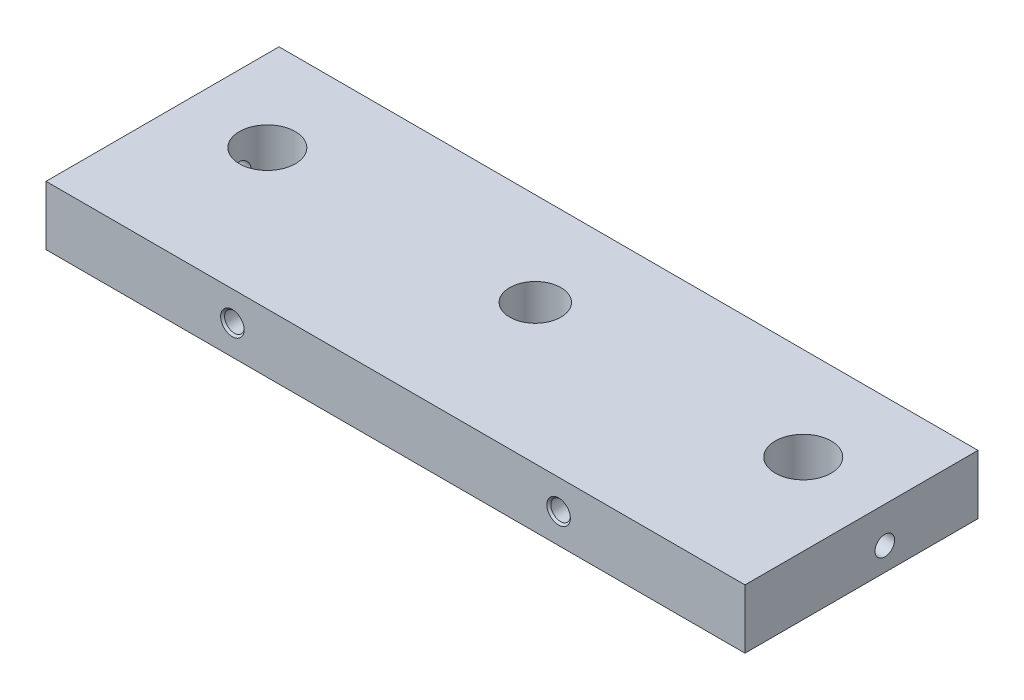
ISO-10303-21;
HEADER;
FILE_DESCRIPTION(('STEP AP214'),'2;1');
FILE_NAME('part.step','',(''),(''),'','','');
FILE_SCHEMA(('AUTOMOTIVE_DESIGN { 1 0 10303 214 1 1 1 1 }'));
ENDSEC;
DATA;
#1=APPLICATION_CONTEXT('core data for automotive mechanical design processes');
#2=APPLICATION_PROTOCOL_DEFINITION('international standard','automotive_design',2000,#1);
#3=PRODUCT_CONTEXT('',#1,'mechanical');
#4=PRODUCT('Part','Part','',(#3));
#5=PRODUCT_RELATED_PRODUCT_CATEGORY('part','',(#4));
#6=PRODUCT_DEFINITION_FORMATION('','',#4);
#7=PRODUCT_DEFINITION_CONTEXT('part definition',#1,'design');
#8=PRODUCT_DEFINITION('design','',#6,#7);
#9=PRODUCT_DEFINITION_SHAPE('','',#8);
#10=(LENGTH_UNIT() NAMED_UNIT(*) SI_UNIT(.MILLI.,.METRE.));
#11=(NAMED_UNIT(*) PLANE_ANGLE_UNIT() SI_UNIT($,.RADIAN.));
#12=(NAMED_UNIT(*) SI_UNIT($,.STERADIAN.) SOLID_ANGLE_UNIT());
#13=UNCERTAINTY_MEASURE_WITH_UNIT(LENGTH_MEASURE(1.E-05),#10,'distance_accuracy_value','');
#14=(GEOMETRIC_REPRESENTATION_CONTEXT(3) GLOBAL_UNCERTAINTY_ASSIGNED_CONTEXT((#13)) GLOBAL_UNIT_ASSIGNED_CONTEXT((#10,
#11,#12)) REPRESENTATION_CONTEXT('',''));
#15=CARTESIAN_POINT('',(0.,0.,0.));
#16=DIRECTION('',(0.,0.,1.));
#17=DIRECTION('',(1.,0.,0.));
#18=AXIS2_PLACEMENT_3D('',#15,#16,#17);
#19=CARTESIAN_POINT('',(0.,12.7,0.));
#20=DIRECTION('',(0.,-1.,0.));
#21=DIRECTION('',(0.,0.,-1.));
#22=AXIS2_PLACEMENT_3D('',#19,#20,#21);
#23=CYLINDRICAL_SURFACE('',#22,2.5);
#24=CARTESIAN_POINT('',(0.,0.,0.));
#25=DIRECTION('',(0.,1.,0.));
#26=DIRECTION('',(0.,0.,1.));
#27=AXIS2_PLACEMENT_3D('',#24,#25,#26);
#28=CIRCLE('',#27,2.5);
#29=CARTESIAN_POINT('',(0.,0.,2.5));
#30=VERTEX_POINT('',#29);
#31=EDGE_CURVE('E171',#30,#30,#28,.T.);
#32=ORIENTED_EDGE('',*,*,#31,.F.);
#33=EDGE_LOOP('',(#32));
#34=FACE_BOUND('',#33,.T.);
#35=CARTESIAN_POINT('',(0.,4.7,0.));
#36=DIRECTION('',(0.,1.,0.));
#37=DIRECTION('',(0.,0.,1.));
#38=AXIS2_PLACEMENT_3D('',#35,#36,#37);
#39=CIRCLE('',#38,2.5);
#40=CARTESIAN_POINT('',(0.,4.7,2.5));
#41=VERTEX_POINT('',#40);
#42=EDGE_CURVE('E168',#41,#41,#39,.T.);
#43=ORIENTED_EDGE('',*,*,#42,.T.);
#44=EDGE_LOOP('',(#43));
#45=FACE_BOUND('',#44,.T.);
#46=ADVANCED_FACE('F53',(#34,#45),#23,.F.);
#47=CARTESIAN_POINT('',(0.,12.7,0.));
#48=DIRECTION('',(0.,1.,0.));
#49=DIRECTION('',(0.,0.,1.));
#50=AXIS2_PLACEMENT_3D('',#47,#48,#49);
#51=PLANE('',#50);
#52=CARTESIAN_POINT('',(57.5,12.7,0.));
#53=DIRECTION('',(0.,1.,0.));
#54=DIRECTION('',(0.,0.,1.));
#55=AXIS2_PLACEMENT_3D('',#52,#53,#54);
#56=CIRCLE('',#55,5.99999999999999);
#57=CARTESIAN_POINT('',(57.5,12.7,5.99999999999998));
#58=VERTEX_POINT('',#57);
#59=EDGE_CURVE('E156',#58,#58,#56,.T.);
#60=ORIENTED_EDGE('',*,*,#59,.F.);
#61=EDGE_LOOP('',(#60));
#62=FACE_BOUND('',#61,.T.);
#63=CARTESIAN_POINT('',(-57.5,12.7,0.));
#64=DIRECTION('',(0.,1.,0.));
#65=DIRECTION('',(0.,0.,1.));
#66=AXIS2_PLACEMENT_3D('',#63,#64,#65);
#67=CIRCLE('',#66,5.99999999999999);
#68=CARTESIAN_POINT('',(-57.5,12.7,5.99999999999997));
#69=VERTEX_POINT('',#68);
#70=EDGE_CURVE('E155',#69,#69,#67,.T.);
#71=ORIENTED_EDGE('',*,*,#70,.F.);
#72=EDGE_LOOP('',(#71));
#73=FACE_BOUND('',#72,.T.);
#74=CARTESIAN_POINT('',(0.,12.7,0.));
#75=DIRECTION('',(0.,1.,0.));
#76=DIRECTION('',(0.,0.,1.));
#77=AXIS2_PLACEMENT_3D('',#74,#75,#76);
#78=CIRCLE('',#77,5.5);
#79=CARTESIAN_POINT('',(0.,12.7,5.5));
#80=VERTEX_POINT('',#79);
#81=EDGE_CURVE('E162',#80,#80,#78,.T.);
#82=ORIENTED_EDGE('',*,*,#81,.F.);
#83=EDGE_LOOP('',(#82));
#84=FACE_BOUND('',#83,.T.);
#85=DIRECTION('',(0.,0.,-1.));
#86=VECTOR('',#85,1.);
#87=CARTESIAN_POINT('',(75.,12.7,-20.));
#88=LINE('',#87,#86);
#89=CARTESIAN_POINT('',(75.,12.7,30.));
#90=VERTEX_POINT('',#89);
#91=CARTESIAN_POINT('',(75.,12.7,-20.));
#92=VERTEX_POINT('',#91);
#93=EDGE_CURVE('E175',#90,#92,#88,.T.);
#94=ORIENTED_EDGE('',*,*,#93,.T.);
#95=DIRECTION('',(-1.,0.,0.));
#96=VECTOR('',#95,1.);
#97=CARTESIAN_POINT('',(-75.,12.7,-20.));
#98=LINE('',#97,#96);
#99=CARTESIAN_POINT('',(-75.,12.7,-20.));
#100=VERTEX_POINT('',#99);
#101=EDGE_CURVE('E77',#92,#100,#98,.T.);
#102=ORIENTED_EDGE('',*,*,#101,.T.);
#103=DIRECTION('',(0.,0.,1.));
#104=VECTOR('',#103,1.);
#105=CARTESIAN_POINT('',(-75.,12.7,-20.));
#106=LINE('',#105,#104);
#107=CARTESIAN_POINT('',(-75.,12.7,30.));
#108=VERTEX_POINT('',#107);
#109=EDGE_CURVE('E178',#100,#108,#106,.T.);
#110=ORIENTED_EDGE('',*,*,#109,.T.);
#111=DIRECTION('',(1.,0.,0.));
#112=VECTOR('',#111,1.);
#113=CARTESIAN_POINT('',(-75.,12.7,30.));
#114=LINE('',#113,#112);
#115=EDGE_CURVE('E135',#108,#90,#114,.T.);
#116=ORIENTED_EDGE('',*,*,#115,.T.);
#117=EDGE_LOOP('',(#94,#102,#110,#116));
#118=FACE_BOUND('',#117,.T.);
#119=ADVANCED_FACE('F228',(#62,#73,#84,#118),#51,.T.);
#120=CARTESIAN_POINT('',(0.,0.,0.));
#121=DIRECTION('',(0.,1.,0.));
#122=DIRECTION('',(0.,0.,1.));
#123=AXIS2_PLACEMENT_3D('',#120,#121,#122);
#124=PLANE('',#123);
#125=CARTESIAN_POINT('',(57.5,0.,0.));
#126=DIRECTION('',(0.,1.,0.));
#127=DIRECTION('',(0.,0.,1.));
#128=AXIS2_PLACEMENT_3D('',#125,#126,#127);
#129=CIRCLE('',#128,5.99999999999999);
#130=CARTESIAN_POINT('',(57.5,0.,5.99999999999998));
#131=VERTEX_POINT('',#130);
#132=EDGE_CURVE('E152',#131,#131,#129,.T.);
#133=ORIENTED_EDGE('',*,*,#132,.T.);
#134=EDGE_LOOP('',(#133));
#135=FACE_BOUND('',#134,.T.);
#136=CARTESIAN_POINT('',(-57.5,0.,0.));
#137=DIRECTION('',(0.,1.,0.));
#138=DIRECTION('',(0.,0.,1.));
#139=AXIS2_PLACEMENT_3D('',#136,#137,#138);
#140=CIRCLE('',#139,5.99999999999999);
#141=CARTESIAN_POINT('',(-57.5,0.,5.99999999999997));
#142=VERTEX_POINT('',#141);
#143=EDGE_CURVE('E159',#142,#142,#140,.T.);
#144=ORIENTED_EDGE('',*,*,#143,.T.);
#145=EDGE_LOOP('',(#144));
#146=FACE_BOUND('',#145,.T.);
#147=DIRECTION('',(0.,0.,-1.));
#148=VECTOR('',#147,1.);
#149=CARTESIAN_POINT('',(75.,0.,-20.));
#150=LINE('',#149,#148);
#151=CARTESIAN_POINT('',(75.,0.,30.));
#152=VERTEX_POINT('',#151);
#153=CARTESIAN_POINT('',(75.,0.,-20.));
#154=VERTEX_POINT('',#153);
#155=EDGE_CURVE('E174',#152,#154,#150,.T.);
#156=ORIENTED_EDGE('',*,*,#155,.F.);
#157=DIRECTION('',(-1.,0.,0.));
#158=VECTOR('',#157,1.);
#159=CARTESIAN_POINT('',(-75.,0.,30.));
#160=LINE('',#159,#158);
#161=CARTESIAN_POINT('',(-75.,0.,30.));
#162=VERTEX_POINT('',#161);
#163=EDGE_CURVE('E142',#152,#162,#160,.T.);
#164=ORIENTED_EDGE('',*,*,#163,.T.);
#165=DIRECTION('',(0.,0.,1.));
#166=VECTOR('',#165,1.);
#167=CARTESIAN_POINT('',(-75.,0.,-20.));
#168=LINE('',#167,#166);
#169=CARTESIAN_POINT('',(-75.,0.,-20.));
#170=VERTEX_POINT('',#169);
#171=EDGE_CURVE('E94',#170,#162,#168,.T.);
#172=ORIENTED_EDGE('',*,*,#171,.F.);
#173=DIRECTION('',(-1.,0.,0.));
#174=VECTOR('',#173,1.);
#175=CARTESIAN_POINT('',(-75.,0.,-20.));
#176=LINE('',#175,#174);
#177=EDGE_CURVE('E88',#154,#170,#176,.T.);
#178=ORIENTED_EDGE('',*,*,#177,.F.);
#179=EDGE_LOOP('',(#156,#164,#172,#178));
#180=FACE_BOUND('',#179,.T.);
#181=ORIENTED_EDGE('',*,*,#31,.T.);
#182=EDGE_LOOP('',(#181));
#183=FACE_BOUND('',#182,.T.);
#184=ADVANCED_FACE('F234',(#135,#146,#180,#183),#124,.F.);
#185=CARTESIAN_POINT('',(75.,12.7,-20.));
#186=DIRECTION('',(-1.,0.,0.));
#187=DIRECTION('',(0.,0.,1.));
#188=AXIS2_PLACEMENT_3D('',#185,#186,#187);
#189=PLANE('',#188);
#190=CARTESIAN_POINT('',(75.,5.,0.));
#191=DIRECTION('',(1.,0.,0.));
#192=DIRECTION('',(0.,0.,-1.));
#193=AXIS2_PLACEMENT_3D('',#190,#191,#192);
#194=CIRCLE('',#193,2.09999999999999);
#195=CARTESIAN_POINT('',(75.,5.,-2.09999999999996));
#196=VERTEX_POINT('',#195);
#197=EDGE_CURVE('E148',#196,#196,#194,.T.);
#198=ORIENTED_EDGE('',*,*,#197,.F.);
#199=EDGE_LOOP('',(#198));
#200=FACE_BOUND('',#199,.T.);
#201=ORIENTED_EDGE('',*,*,#155,.T.);
#202=DIRECTION('',(0.,-1.,0.));
#203=VECTOR('',#202,1.);
#204=CARTESIAN_POINT('',(75.,12.7,-20.));
#205=LINE('',#204,#203);
#206=EDGE_CURVE('E13',#92,#154,#205,.T.);
#207=ORIENTED_EDGE('',*,*,#206,.F.);
#208=ORIENTED_EDGE('',*,*,#93,.F.);
#209=DIRECTION('',(0.,1.,0.));
#210=VECTOR('',#209,1.);
#211=CARTESIAN_POINT('',(75.,-150.332963783729,30.));
#212=LINE('',#211,#210);
#213=EDGE_CURVE('E139',#152,#90,#212,.T.);
#214=ORIENTED_EDGE('',*,*,#213,.F.);
#215=EDGE_LOOP('',(#201,#207,#208,#214));
#216=FACE_BOUND('',#215,.T.);
#217=ADVANCED_FACE('F55',(#200,#216),#189,.F.);
#218=CARTESIAN_POINT('',(-75.,12.7,-20.));
#219=DIRECTION('',(0.,0.,1.));
#220=DIRECTION('',(1.,0.,0.));
#221=AXIS2_PLACEMENT_3D('',#218,#219,#220);
#222=PLANE('',#221);
#223=ORIENTED_EDGE('',*,*,#177,.T.);
#224=DIRECTION('',(0.,-1.,0.));
#225=VECTOR('',#224,1.);
#226=CARTESIAN_POINT('',(-75.,12.7,-20.));
#227=LINE('',#226,#225);
#228=EDGE_CURVE('E68',#100,#170,#227,.T.);
#229=ORIENTED_EDGE('',*,*,#228,.F.);
#230=ORIENTED_EDGE('',*,*,#101,.F.);
#231=ORIENTED_EDGE('',*,*,#206,.T.);
#232=EDGE_LOOP('',(#223,#229,#230,#231));
#233=FACE_BOUND('',#232,.T.);
#234=ADVANCED_FACE('F248',(#233),#222,.F.);
#235=CARTESIAN_POINT('',(-75.,12.7,-20.));
#236=DIRECTION('',(1.,0.,0.));
#237=DIRECTION('',(0.,0.,-1.));
#238=AXIS2_PLACEMENT_3D('',#235,#236,#237);
#239=PLANE('',#238);
#240=CARTESIAN_POINT('',(-75.,5.,0.));
#241=DIRECTION('',(-1.,0.,0.));
#242=DIRECTION('',(0.,0.,1.));
#243=AXIS2_PLACEMENT_3D('',#240,#241,#242);
#244=CIRCLE('',#243,2.09999999999999);
#245=CARTESIAN_POINT('',(-75.,5.,2.10000000000002));
#246=VERTEX_POINT('',#245);
#247=EDGE_CURVE('E145',#246,#246,#244,.T.);
#248=ORIENTED_EDGE('',*,*,#247,.F.);
#249=EDGE_LOOP('',(#248));
#250=FACE_BOUND('',#249,.T.);
#251=ORIENTED_EDGE('',*,*,#171,.T.);
#252=DIRECTION('',(0.,1.,0.));
#253=VECTOR('',#252,1.);
#254=CARTESIAN_POINT('',(-75.,-150.332963783729,30.));
#255=LINE('',#254,#253);
#256=EDGE_CURVE('E138',#162,#108,#255,.T.);
#257=ORIENTED_EDGE('',*,*,#256,.T.);
#258=ORIENTED_EDGE('',*,*,#109,.F.);
#259=ORIENTED_EDGE('',*,*,#228,.T.);
#260=EDGE_LOOP('',(#251,#257,#258,#259));
#261=FACE_BOUND('',#260,.T.);
#262=ADVANCED_FACE('F246',(#250,#261),#239,.F.);
#263=CARTESIAN_POINT('',(0.,4.7,0.));
#264=DIRECTION('',(0.,1.,0.));
#265=DIRECTION('',(0.,0.,1.));
#266=AXIS2_PLACEMENT_3D('',#263,#264,#265);
#267=CYLINDRICAL_SURFACE('',#266,5.5);
#268=CARTESIAN_POINT('',(0.,4.7,0.));
#269=DIRECTION('',(0.,1.,0.));
#270=DIRECTION('',(0.,0.,1.));
#271=AXIS2_PLACEMENT_3D('',#268,#269,#270);
#272=CIRCLE('',#271,5.5);
#273=CARTESIAN_POINT('',(0.,4.7,5.5));
#274=VERTEX_POINT('',#273);
#275=EDGE_CURVE('E165',#274,#274,#272,.T.);
#276=ORIENTED_EDGE('',*,*,#275,.F.);
#277=EDGE_LOOP('',(#276));
#278=FACE_BOUND('',#277,.T.);
#279=ORIENTED_EDGE('',*,*,#81,.T.);
#280=EDGE_LOOP('',(#279));
#281=FACE_BOUND('',#280,.T.);
#282=ADVANCED_FACE('F240',(#278,#281),#267,.F.);
#283=CARTESIAN_POINT('',(0.,4.7,0.));
#284=DIRECTION('',(0.,1.,0.));
#285=DIRECTION('',(0.,0.,1.));
#286=AXIS2_PLACEMENT_3D('',#283,#284,#285);
#287=PLANE('',#286);
#288=ORIENTED_EDGE('',*,*,#42,.F.);
#289=EDGE_LOOP('',(#288));
#290=FACE_BOUND('',#289,.T.);
#291=ORIENTED_EDGE('',*,*,#275,.T.);
#292=EDGE_LOOP('',(#291));
#293=FACE_BOUND('',#292,.T.);
#294=ADVANCED_FACE('F283',(#290,#293),#287,.T.);
#295=CARTESIAN_POINT('',(-57.5,0.,0.));
#296=DIRECTION('',(0.,1.,0.));
#297=DIRECTION('',(0.,0.,1.));
#298=AXIS2_PLACEMENT_3D('',#295,#296,#297);
#299=CYLINDRICAL_SURFACE('',#298,5.99999999999999);
#300=CARTESIAN_POINT('',(-63.1204981985585,5.,2.10000000000002));
#301=CARTESIAN_POINT('',(-63.1204966458315,5.1140091370659,2.1000018339205));
#302=CARTESIAN_POINT('',(-63.124004968313,5.22800549976908,2.09068443415072));
#303=CARTESIAN_POINT('',(-63.1375766475587,5.45259753612682,2.05380341211712));
#304=CARTESIAN_POINT('',(-63.1476405489665,5.5631929264259,2.0262382738113));
#305=CARTESIAN_POINT('',(-63.1730467856986,5.77768801016566,1.95396754262055));
#306=CARTESIAN_POINT('',(-63.1883778981936,5.88160138658303,1.90929837025932));
#307=CARTESIAN_POINT('',(-63.2225741385746,6.08049606044282,1.80421393109005));
#308=CARTESIAN_POINT('',(-63.241440164637,6.17547507854585,1.7437946608533));
#309=CARTESIAN_POINT('',(-63.2814940549531,6.35790717006958,1.6061297637904));
#310=CARTESIAN_POINT('',(-63.3027439771116,6.44491870630237,1.52831692511241));
#311=CARTESIAN_POINT('',(-63.3446495230056,6.60496249641996,1.35928149750695));
#312=CARTESIAN_POINT('',(-63.3653050393113,6.67799223662496,1.26805650251295));
#313=CARTESIAN_POINT('',(-63.4044203342876,6.81005007735195,1.07151011163138));
#314=CARTESIAN_POINT('',(-63.4227987194029,6.86860885404572,0.965855744444216));
#315=CARTESIAN_POINT('',(-63.4545521614655,6.96694377064913,0.745440860528128));
#316=CARTESIAN_POINT('',(-63.4679287144991,7.00672552784472,0.630683079168889));
#317=CARTESIAN_POINT('',(-63.487731406374,7.06486014648584,0.399953329353765));
#318=CARTESIAN_POINT('',(-63.4944026630635,7.08397084703124,0.284193742860517));
#319=CARTESIAN_POINT('',(-63.500916889704,7.10263770519153,0.0509313612863235));
#320=CARTESIAN_POINT('',(-63.5007617963171,7.10219940893304,-0.0665709299255688));
#321=CARTESIAN_POINT('',(-63.4938029881401,7.08224623019269,-0.294593124821921));
#322=CARTESIAN_POINT('',(-63.4872866813232,7.06355598179706,-0.405195428634518));
#323=CARTESIAN_POINT('',(-63.4687047041447,7.00900218324641,-0.621581077155464));
#324=CARTESIAN_POINT('',(-63.4566386491988,6.97313744293342,-0.727364087339952));
#325=CARTESIAN_POINT('',(-63.4279632181631,6.88481041807335,-0.932828899090593));
#326=CARTESIAN_POINT('',(-63.4112935314734,6.83212624879887,-1.03240655008797));
#327=CARTESIAN_POINT('',(-63.3751275446253,6.71184352800499,-1.22154070440795));
#328=CARTESIAN_POINT('',(-63.3556304054743,6.64424054649508,-1.31109421923471));
#329=CARTESIAN_POINT('',(-63.3146607396164,6.49195271186357,-1.48252795143933));
#330=CARTESIAN_POINT('',(-63.293138193974,6.40656677898385,-1.56377436704441));
#331=CARTESIAN_POINT('',(-63.2513741792681,6.22321760973066,-1.71101327031468));
#332=CARTESIAN_POINT('',(-63.2311329525691,6.12525200443313,-1.77700287834314));
#333=CARTESIAN_POINT('',(-63.1939329395488,5.91732795856173,-1.89285691923173));
#334=CARTESIAN_POINT('',(-63.1770363214733,5.80719282631497,-1.94242576165354));
#335=CARTESIAN_POINT('',(-63.1491557259306,5.57939519101917,-2.02208854460279));
#336=CARTESIAN_POINT('',(-63.1381689626197,5.46173626392651,-2.05219166242459));
#337=CARTESIAN_POINT('',(-63.1239926358183,5.2284219502318,-2.09071998372685));
#338=CARTESIAN_POINT('',(-63.1204464929988,5.1129521614298,-2.10013762361123));
#339=CARTESIAN_POINT('',(-63.1205510138731,4.88205250370018,-2.09985940605156));
#340=CARTESIAN_POINT('',(-63.1242001922755,4.76662263145226,-2.09016749328912));
#341=CARTESIAN_POINT('',(-63.1379260131842,4.54380912898156,-2.05284050372254));
#342=CARTESIAN_POINT('',(-63.1477449606931,4.43628747984392,-2.02592405668399));
#343=CARTESIAN_POINT('',(-63.1724118358719,4.22731815862595,-1.95579041232055));
#344=CARTESIAN_POINT('',(-63.187260710863,4.12587163495472,-1.91257014420928));
#345=CARTESIAN_POINT('',(-63.2209397100575,3.92809433349761,-1.80938709290028));
#346=CARTESIAN_POINT('',(-63.2398883080368,3.83205588297778,-1.74890374170461));
#347=CARTESIAN_POINT('',(-63.2794141217829,3.65113493086169,-1.61348700379824));
#348=CARTESIAN_POINT('',(-63.299991862819,3.56625605100199,-1.53854894531551));
#349=CARTESIAN_POINT('',(-63.3417987141558,3.40532762874549,-1.37155948469128));
#350=CARTESIAN_POINT('',(-63.3630031413794,3.33000068441338,-1.27880333095804));
#351=CARTESIAN_POINT('',(-63.4025922369693,3.19591891840493,-1.08144356167346));
#352=CARTESIAN_POINT('',(-63.4209769708418,3.13716371171272,-0.976840221450291));
#353=CARTESIAN_POINT('',(-63.4527928174187,3.03838744346695,-0.759129698058994));
#354=CARTESIAN_POINT('',(-63.4662513931254,2.99826217380438,-0.646074027219683));
#355=CARTESIAN_POINT('',(-63.4868116209636,2.93778465141936,-0.414248850041598));
#356=CARTESIAN_POINT('',(-63.4939158314934,2.91742444059474,-0.295481663590913));
#357=CARTESIAN_POINT('',(-63.5007543784024,2.89782775243787,-0.0621821302513846));
#358=CARTESIAN_POINT('',(-63.5008490305037,2.8975585229167,0.0522537808564348));
#359=CARTESIAN_POINT('',(-63.4945652025212,2.91556165774852,0.279465044357248));
#360=CARTESIAN_POINT('',(-63.488187341248,2.93383224958515,0.392240554448695));
#361=CARTESIAN_POINT('',(-63.4698207390078,2.98769281511968,0.610778183645926));
#362=CARTESIAN_POINT('',(-63.4579408866853,3.0229471878998,0.716632835676179));
#363=CARTESIAN_POINT('',(-63.4297968290422,3.10945562590669,0.920954416283868));
#364=CARTESIAN_POINT('',(-63.4135318086933,3.16071266567333,1.01941996716774));
#365=CARTESIAN_POINT('',(-63.3774819301746,3.2800726297771,1.21038035179721));
#366=CARTESIAN_POINT('',(-63.3575841614481,3.34875672859404,1.30249027603848));
#367=CARTESIAN_POINT('',(-63.3167443389257,3.50006159937585,1.47420813664786));
#368=CARTESIAN_POINT('',(-63.2958019368387,3.58268704169577,1.55381186612158));
#369=CARTESIAN_POINT('',(-63.254114729544,3.76390225412879,1.70186578231576));
#370=CARTESIAN_POINT('',(-63.2334198977672,3.86303759965216,1.76966457617211));
#371=CARTESIAN_POINT('',(-63.1956781363437,4.07194862858986,1.88761831198952));
#372=CARTESIAN_POINT('',(-63.1786307346966,4.18172293258171,1.93777553742173));
#373=CARTESIAN_POINT('',(-63.1505252243276,4.40768257816286,2.01826100468313));
#374=CARTESIAN_POINT('',(-63.1394028261945,4.52378337592957,2.04880286372062));
#375=CARTESIAN_POINT('',(-63.1243917548635,4.75992869919569,2.08966685598285));
#376=CARTESIAN_POINT('',(-63.1204998332662,4.87997142904268,2.09999806925255));
#377=CARTESIAN_POINT('',(-63.1204981985585,5.,2.10000000000002));
#378=B_SPLINE_CURVE_WITH_KNOTS('',3,(#300,#301,#302,#303,#304,#305,#306,#307,#308,#309,#310,
#311,#312,#313,#314,#315,#316,#317,#318,#319,#320,#321,#322,#323,#324,#325,#326,#327,#328,#329,
#330,#331,#332,#333,#334,#335,#336,#337,#338,#339,#340,#341,#342,#343,#344,#345,#346,#347,#348,
#349,#350,#351,#352,#353,#354,#355,#356,#357,#358,#359,#360,#361,#362,#363,#364,#365,#366,#367,
#368,#369,#370,#371,#372,#373,#374,#375,#376,#377),.UNSPECIFIED.,.T.,.F.,(4,2,2,2,2,2,2,2,2,2,2,
2,2,2,2,2,2,2,2,2,2,2,2,2,2,2,2,2,2,2,2,2,2,2,2,2,2,2,4),(0.,0.341581962713035,
0.683192307989642,1.02407925348462,1.36505293174606,1.71940579240762,2.07382229975039,
2.43855298376331,2.80317448659719,3.15392083853409,3.5045676829967,3.8400719478235,
4.17559946579063,4.51575014165979,4.85600195806707,5.213799059425,5.57166363794493,
5.93565848344082,6.29948159486755,6.6454288702843,6.99130474115208,7.32361553252675,
7.6559889451342,7.99969400689681,8.34351034108725,8.70586039893279,9.06820203750371,
9.42849171734221,9.78863627174603,10.1302545747611,10.471840220127,10.806936933281,
11.1420959705822,11.4903822545165,11.8387854469785,12.2026433598833,12.5664541587759,
12.9262325794049,13.2858493250833),.UNSPECIFIED.);
#379=CARTESIAN_POINT('',(-63.1204981985585,5.,2.10000000000002));
#380=VERTEX_POINT('',#379);
#381=EDGE_CURVE('E57',#380,#380,#378,.T.);
#382=ORIENTED_EDGE('',*,*,#381,.T.);
#383=EDGE_LOOP('',(#382));
#384=FACE_BOUND('',#383,.T.);
#385=ORIENTED_EDGE('',*,*,#143,.F.);
#386=EDGE_LOOP('',(#385));
#387=FACE_BOUND('',#386,.T.);
#388=ORIENTED_EDGE('',*,*,#70,.T.);
#389=EDGE_LOOP('',(#388));
#390=FACE_BOUND('',#389,.T.);
#391=ADVANCED_FACE('F273',(#384,#387,#390),#299,.F.);
#392=CARTESIAN_POINT('',(57.5,0.,0.));
#393=DIRECTION('',(0.,1.,0.));
#394=DIRECTION('',(0.,0.,1.));
#395=AXIS2_PLACEMENT_3D('',#392,#393,#394);
#396=CYLINDRICAL_SURFACE('',#395,5.99999999999999);
#397=CARTESIAN_POINT('',(63.1204981985585,5.,-2.09999999999996));
#398=CARTESIAN_POINT('',(63.1204966458315,5.1140091370659,-2.10000183392044));
#399=CARTESIAN_POINT('',(63.124004968313,5.22800549976908,-2.09068443415066));
#400=CARTESIAN_POINT('',(63.1375766475587,5.45259753612682,-2.05380341211706));
#401=CARTESIAN_POINT('',(63.1476405489665,5.5631929264259,-2.02623827381124));
#402=CARTESIAN_POINT('',(63.1730467856986,5.77768801016566,-1.95396754262049));
#403=CARTESIAN_POINT('',(63.1883778981936,5.88160138658303,-1.90929837025926));
#404=CARTESIAN_POINT('',(63.2225741385746,6.08049606044283,-1.80421393108999));
#405=CARTESIAN_POINT('',(63.241440164637,6.17547507854585,-1.74379466085324));
#406=CARTESIAN_POINT('',(63.2814940549531,6.35790717006958,-1.60612976379034));
#407=CARTESIAN_POINT('',(63.3027439771117,6.44491870630238,-1.52831692511235));
#408=CARTESIAN_POINT('',(63.3446495230056,6.60496249641997,-1.35928149750689));
#409=CARTESIAN_POINT('',(63.3653050393113,6.67799223662497,-1.26805650251289));
#410=CARTESIAN_POINT('',(63.4044203342876,6.81005007735196,-1.07151011163132));
#411=CARTESIAN_POINT('',(63.4227987194029,6.86860885404572,-0.965855744444151));
#412=CARTESIAN_POINT('',(63.4545521614655,6.96694377064913,-0.745440860528063));
#413=CARTESIAN_POINT('',(63.4679287144991,7.00672552784473,-0.630683079168824));
#414=CARTESIAN_POINT('',(63.487731406374,7.06486014648584,-0.399953329353701));
#415=CARTESIAN_POINT('',(63.4944026630635,7.08397084703124,-0.284193742860453));
#416=CARTESIAN_POINT('',(63.5009168897039,7.10263770519153,-0.0509313612862595));
#417=CARTESIAN_POINT('',(63.5007617963171,7.10219940893304,0.0665709299256325));
#418=CARTESIAN_POINT('',(63.4938029881401,7.08224623019269,0.294593124821984));
#419=CARTESIAN_POINT('',(63.4872866813232,7.06355598179706,0.40519542863458));
#420=CARTESIAN_POINT('',(63.4687047041447,7.00900218324641,0.621581077155526));
#421=CARTESIAN_POINT('',(63.4566386491988,6.97313744293342,0.727364087340013));
#422=CARTESIAN_POINT('',(63.4279632181631,6.88481041807335,0.932828899090654));
#423=CARTESIAN_POINT('',(63.4112935314734,6.83212624879887,1.03240655008803));
#424=CARTESIAN_POINT('',(63.3751275446253,6.71184352800499,1.22154070440802));
#425=CARTESIAN_POINT('',(63.3556304054743,6.64424054649508,1.31109421923478));
#426=CARTESIAN_POINT('',(63.3146607396164,6.49195271186357,1.48252795143939));
#427=CARTESIAN_POINT('',(63.2931381939739,6.40656677898385,1.56377436704447));
#428=CARTESIAN_POINT('',(63.2513741792681,6.22321760973066,1.71101327031474));
#429=CARTESIAN_POINT('',(63.231132952569,6.12525200443312,1.7770028783432));
#430=CARTESIAN_POINT('',(63.1939329395487,5.91732795856173,1.89285691923179));
#431=CARTESIAN_POINT('',(63.1770363214732,5.80719282631497,1.94242576165361));
#432=CARTESIAN_POINT('',(63.1491557259306,5.57939519101917,2.02208854460285));
#433=CARTESIAN_POINT('',(63.1381689626196,5.4617362639265,2.05219166242465));
#434=CARTESIAN_POINT('',(63.1239926358182,5.2284219502318,2.09071998372691));
#435=CARTESIAN_POINT('',(63.1204464929988,5.11295216142979,2.10013762361129));
#436=CARTESIAN_POINT('',(63.120551013873,4.88205250370017,2.09985940605162));
#437=CARTESIAN_POINT('',(63.1242001922755,4.76662263145225,2.09016749328918));
#438=CARTESIAN_POINT('',(63.1379260131841,4.54380912898156,2.0528405037226));
#439=CARTESIAN_POINT('',(63.1477449606931,4.43628747984392,2.02592405668405));
#440=CARTESIAN_POINT('',(63.1724118358719,4.22731815862595,1.95579041232061));
#441=CARTESIAN_POINT('',(63.187260710863,4.12587163495472,1.91257014420934));
#442=CARTESIAN_POINT('',(63.2209397100574,3.92809433349761,1.80938709290034));
#443=CARTESIAN_POINT('',(63.2398883080367,3.83205588297778,1.74890374170467));
#444=CARTESIAN_POINT('',(63.2794141217829,3.65113493086169,1.6134870037983));
#445=CARTESIAN_POINT('',(63.2999918628189,3.56625605100199,1.53854894531557));
#446=CARTESIAN_POINT('',(63.3417987141557,3.40532762874549,1.37155948469134));
#447=CARTESIAN_POINT('',(63.3630031413794,3.33000068441339,1.2788033309581));
#448=CARTESIAN_POINT('',(63.4025922369693,3.19591891840493,1.08144356167352));
#449=CARTESIAN_POINT('',(63.4209769708418,3.13716371171272,0.976840221450354));
#450=CARTESIAN_POINT('',(63.4527928174186,3.03838744346695,0.759129698059055));
#451=CARTESIAN_POINT('',(63.4662513931254,2.99826217380438,0.646074027219743));
#452=CARTESIAN_POINT('',(63.4868116209636,2.93778465141936,0.414248850041657));
#453=CARTESIAN_POINT('',(63.4939158314934,2.91742444059474,0.295481663590971));
#454=CARTESIAN_POINT('',(63.5007543784024,2.89782775243787,0.0621821302514428));
#455=CARTESIAN_POINT('',(63.5008490305037,2.8975585229167,-0.0522537808563766));
#456=CARTESIAN_POINT('',(63.4945652025212,2.91556165774852,-0.279465044357189));
#457=CARTESIAN_POINT('',(63.488187341248,2.93383224958515,-0.392240554448637));
#458=CARTESIAN_POINT('',(63.4698207390078,2.98769281511968,-0.610778183645868));
#459=CARTESIAN_POINT('',(63.4579408866853,3.0229471878998,-0.71663283567612));
#460=CARTESIAN_POINT('',(63.4297968290422,3.10945562590669,-0.92095441628381));
#461=CARTESIAN_POINT('',(63.4135318086933,3.16071266567333,-1.01941996716768));
#462=CARTESIAN_POINT('',(63.3774819301746,3.2800726297771,-1.21038035179715));
#463=CARTESIAN_POINT('',(63.3575841614481,3.34875672859404,-1.30249027603843));
#464=CARTESIAN_POINT('',(63.3167443389257,3.50006159937586,-1.47420813664781));
#465=CARTESIAN_POINT('',(63.2958019368387,3.58268704169578,-1.55381186612152));
#466=CARTESIAN_POINT('',(63.254114729544,3.7639022541288,-1.7018657823157));
#467=CARTESIAN_POINT('',(63.2334198977672,3.86303759965216,-1.76966457617205));
#468=CARTESIAN_POINT('',(63.1956781363437,4.07194862858986,-1.88761831198946));
#469=CARTESIAN_POINT('',(63.1786307346966,4.18172293258171,-1.93777553742167));
#470=CARTESIAN_POINT('',(63.1505252243276,4.40768257816285,-2.01826100468307));
#471=CARTESIAN_POINT('',(63.1394028261945,4.52378337592957,-2.04880286372056));
#472=CARTESIAN_POINT('',(63.1243917548635,4.75992869919569,-2.08966685598279));
#473=CARTESIAN_POINT('',(63.1204998332662,4.87997142904268,-2.09999806925249));
#474=CARTESIAN_POINT('',(63.1204981985585,5.,-2.09999999999996));
#475=B_SPLINE_CURVE_WITH_KNOTS('',3,(#397,#398,#399,#400,#401,#402,#403,#404,#405,#406,#407,
#408,#409,#410,#411,#412,#413,#414,#415,#416,#417,#418,#419,#420,#421,#422,#423,#424,#425,#426,
#427,#428,#429,#430,#431,#432,#433,#434,#435,#436,#437,#438,#439,#440,#441,#442,#443,#444,#445,
#446,#447,#448,#449,#450,#451,#452,#453,#454,#455,#456,#457,#458,#459,#460,#461,#462,#463,#464,
#465,#466,#467,#468,#469,#470,#471,#472,#473,#474),.UNSPECIFIED.,.T.,.F.,(4,2,2,2,2,2,2,2,2,2,2,
2,2,2,2,2,2,2,2,2,2,2,2,2,2,2,2,2,2,2,2,2,2,2,2,2,2,2,4),(0.,0.341581962713036,
0.683192307989643,1.02407925348462,1.36505293174606,1.71940579240763,2.07382229975039,
2.43855298376331,2.80317448659719,3.15392083853409,3.5045676829967,3.84007194782349,
4.17559946579063,4.51575014165979,4.85600195806707,5.213799059425,5.57166363794493,
5.93565848344082,6.29948159486755,6.6454288702843,6.99130474115208,7.32361553252675,
7.6559889451342,7.99969400689681,8.34351034108725,8.70586039893278,9.06820203750371,
9.42849171734221,9.78863627174603,10.1302545747611,10.471840220127,10.806936933281,
11.1420959705822,11.4903822545165,11.8387854469785,12.2026433598833,12.5664541587759,
12.9262325794049,13.2858493250833),.UNSPECIFIED.);
#476=CARTESIAN_POINT('',(63.1204981985585,5.,-2.09999999999996));
#477=VERTEX_POINT('',#476);
#478=EDGE_CURVE('E151',#477,#477,#475,.T.);
#479=ORIENTED_EDGE('',*,*,#478,.T.);
#480=EDGE_LOOP('',(#479));
#481=FACE_BOUND('',#480,.T.);
#482=ORIENTED_EDGE('',*,*,#132,.F.);
#483=EDGE_LOOP('',(#482));
#484=FACE_BOUND('',#483,.T.);
#485=ORIENTED_EDGE('',*,*,#59,.T.);
#486=EDGE_LOOP('',(#485));
#487=FACE_BOUND('',#486,.T.);
#488=ADVANCED_FACE('F192',(#481,#484,#487),#396,.F.);
#489=CARTESIAN_POINT('',(75.,5.,0.));
#490=DIRECTION('',(1.,0.,0.));
#491=DIRECTION('',(0.,0.,-1.));
#492=AXIS2_PLACEMENT_3D('',#489,#490,#491);
#493=CYLINDRICAL_SURFACE('',#492,2.09999999999999);
#494=ORIENTED_EDGE('',*,*,#197,.T.);
#495=EDGE_LOOP('',(#494));
#496=FACE_BOUND('',#495,.T.);
#497=ORIENTED_EDGE('',*,*,#478,.F.);
#498=EDGE_LOOP('',(#497));
#499=FACE_BOUND('',#498,.T.);
#500=ADVANCED_FACE('F194',(#496,#499),#493,.F.);
#501=CARTESIAN_POINT('',(-75.,5.,0.));
#502=DIRECTION('',(-1.,0.,0.));
#503=DIRECTION('',(0.,0.,1.));
#504=AXIS2_PLACEMENT_3D('',#501,#502,#503);
#505=CYLINDRICAL_SURFACE('',#504,2.09999999999999);
#506=ORIENTED_EDGE('',*,*,#247,.T.);
#507=EDGE_LOOP('',(#506));
#508=FACE_BOUND('',#507,.T.);
#509=ORIENTED_EDGE('',*,*,#381,.F.);
#510=EDGE_LOOP('',(#509));
#511=FACE_BOUND('',#510,.T.);
#512=ADVANCED_FACE('F197',(#508,#511),#505,.F.);
#513=CARTESIAN_POINT('',(-75.,-150.332963783729,30.));
#514=DIRECTION('',(0.,0.,1.));
#515=DIRECTION('',(1.,0.,0.));
#516=AXIS2_PLACEMENT_3D('',#513,#514,#515);
#517=PLANE('',#516);
#518=CARTESIAN_POINT('',(35.,6.35,30.));
#519=DIRECTION('',(0.,0.,1.));
#520=DIRECTION('',(1.,0.,0.));
#521=AXIS2_PLACEMENT_3D('',#518,#519,#520);
#522=CIRCLE('',#521,2.525);
#523=CARTESIAN_POINT('',(37.525,6.35,30.));
#524=VERTEX_POINT('',#523);
#525=EDGE_CURVE('E126',#524,#524,#522,.T.);
#526=ORIENTED_EDGE('',*,*,#525,.F.);
#527=EDGE_LOOP('',(#526));
#528=FACE_BOUND('',#527,.T.);
#529=CARTESIAN_POINT('',(-35.,6.35,30.));
#530=DIRECTION('',(0.,0.,1.));
#531=DIRECTION('',(1.,0.,0.));
#532=AXIS2_PLACEMENT_3D('',#529,#530,#531);
#533=CIRCLE('',#532,2.525);
#534=CARTESIAN_POINT('',(-32.475,6.35,30.));
#535=VERTEX_POINT('',#534);
#536=EDGE_CURVE('E119',#535,#535,#533,.T.);
#537=ORIENTED_EDGE('',*,*,#536,.F.);
#538=EDGE_LOOP('',(#537));
#539=FACE_BOUND('',#538,.T.);
#540=ORIENTED_EDGE('',*,*,#163,.F.);
#541=ORIENTED_EDGE('',*,*,#213,.T.);
#542=ORIENTED_EDGE('',*,*,#115,.F.);
#543=ORIENTED_EDGE('',*,*,#256,.F.);
#544=EDGE_LOOP('',(#540,#541,#542,#543));
#545=FACE_BOUND('',#544,.T.);
#546=ADVANCED_FACE('F202',(#528,#539,#545),#517,.T.);
#547=CARTESIAN_POINT('',(-35.,6.35,17.6));
#548=DIRECTION('',(0.,0.,1.));
#549=DIRECTION('',(1.,0.,0.));
#550=AXIS2_PLACEMENT_3D('',#547,#548,#549);
#551=CONICAL_SURFACE('',#550,2.1,1.02974425867665);
#552=CARTESIAN_POINT('',(-35.,6.35,16.3381927000421));
#553=VERTEX_POINT('',#552);
#554=VERTEX_LOOP('',#553);
#555=FACE_BOUND('',#554,.T.);
#556=CARTESIAN_POINT('',(-35.,6.35,17.6));
#557=DIRECTION('',(0.,0.,1.));
#558=DIRECTION('',(1.,0.,0.));
#559=AXIS2_PLACEMENT_3D('',#556,#557,#558);
#560=CIRCLE('',#559,2.1);
#561=CARTESIAN_POINT('',(-32.9,6.35,17.6));
#562=VERTEX_POINT('',#561);
#563=EDGE_CURVE('E132',#562,#562,#560,.T.);
#564=ORIENTED_EDGE('',*,*,#563,.T.);
#565=EDGE_LOOP('',(#564));
#566=FACE_BOUND('',#565,.T.);
#567=ADVANCED_FACE('F206',(#555,#566),#551,.F.);
#568=CARTESIAN_POINT('',(-35.,6.35,30.));
#569=DIRECTION('',(0.,0.,1.));
#570=DIRECTION('',(1.,0.,0.));
#571=AXIS2_PLACEMENT_3D('',#568,#569,#570);
#572=CYLINDRICAL_SURFACE('',#571,2.1);
#573=ORIENTED_EDGE('',*,*,#563,.F.);
#574=EDGE_LOOP('',(#573));
#575=FACE_BOUND('',#574,.T.);
#576=CARTESIAN_POINT('',(-35.,6.35,29.575));
#577=DIRECTION('',(0.,0.,1.));
#578=DIRECTION('',(1.,0.,0.));
#579=AXIS2_PLACEMENT_3D('',#576,#577,#578);
#580=CIRCLE('',#579,2.1);
#581=CARTESIAN_POINT('',(-32.9,6.35,29.575));
#582=VERTEX_POINT('',#581);
#583=EDGE_CURVE('E123',#582,#582,#580,.T.);
#584=ORIENTED_EDGE('',*,*,#583,.T.);
#585=EDGE_LOOP('',(#584));
#586=FACE_BOUND('',#585,.T.);
#587=ADVANCED_FACE('F210',(#575,#586),#572,.F.);
#588=CARTESIAN_POINT('',(-35.,6.35,30.));
#589=DIRECTION('',(0.,0.,1.));
#590=DIRECTION('',(1.,0.,0.));
#591=AXIS2_PLACEMENT_3D('',#588,#589,#590);
#592=CONICAL_SURFACE('',#591,2.525,0.785398163397448);
#593=ORIENTED_EDGE('',*,*,#583,.F.);
#594=EDGE_LOOP('',(#593));
#595=FACE_BOUND('',#594,.T.);
#596=ORIENTED_EDGE('',*,*,#536,.T.);
#597=EDGE_LOOP('',(#596));
#598=FACE_BOUND('',#597,.T.);
#599=ADVANCED_FACE('F113',(#595,#598),#592,.F.);
#600=CARTESIAN_POINT('',(35.,6.35,17.6));
#601=DIRECTION('',(0.,0.,1.));
#602=DIRECTION('',(1.,0.,0.));
#603=AXIS2_PLACEMENT_3D('',#600,#601,#602);
#604=CONICAL_SURFACE('',#603,2.09999999999998,1.02974425867665);
#605=CARTESIAN_POINT('',(35.,6.35,16.3381927000421));
#606=VERTEX_POINT('',#605);
#607=VERTEX_LOOP('',#606);
#608=FACE_BOUND('',#607,.T.);
#609=CARTESIAN_POINT('',(35.,6.35,17.6));
#610=DIRECTION('',(0.,0.,1.));
#611=DIRECTION('',(1.,0.,0.));
#612=AXIS2_PLACEMENT_3D('',#609,#610,#611);
#613=CIRCLE('',#612,2.09999999999998);
#614=CARTESIAN_POINT('',(37.1,6.35,17.6));
#615=VERTEX_POINT('',#614);
#616=EDGE_CURVE('E117',#615,#615,#613,.T.);
#617=ORIENTED_EDGE('',*,*,#616,.T.);
#618=EDGE_LOOP('',(#617));
#619=FACE_BOUND('',#618,.T.);
#620=ADVANCED_FACE('F109',(#608,#619),#604,.F.);
#621=CARTESIAN_POINT('',(35.,6.35,30.));
#622=DIRECTION('',(0.,0.,1.));
#623=DIRECTION('',(1.,0.,0.));
#624=AXIS2_PLACEMENT_3D('',#621,#622,#623);
#625=CYLINDRICAL_SURFACE('',#624,2.09999999999999);
#626=ORIENTED_EDGE('',*,*,#616,.F.);
#627=EDGE_LOOP('',(#626));
#628=FACE_BOUND('',#627,.T.);
#629=CARTESIAN_POINT('',(35.,6.35,29.575));
#630=DIRECTION('',(0.,0.,1.));
#631=DIRECTION('',(1.,0.,0.));
#632=AXIS2_PLACEMENT_3D('',#629,#630,#631);
#633=CIRCLE('',#632,2.09999999999999);
#634=CARTESIAN_POINT('',(37.1,6.35,29.575));
#635=VERTEX_POINT('',#634);
#636=EDGE_CURVE('E120',#635,#635,#633,.T.);
#637=ORIENTED_EDGE('',*,*,#636,.T.);
#638=EDGE_LOOP('',(#637));
#639=FACE_BOUND('',#638,.T.);
#640=ADVANCED_FACE('F112',(#628,#639),#625,.F.);
#641=CARTESIAN_POINT('',(35.,6.35,30.));
#642=DIRECTION('',(0.,0.,1.));
#643=DIRECTION('',(1.,0.,0.));
#644=AXIS2_PLACEMENT_3D('',#641,#642,#643);
#645=CONICAL_SURFACE('',#644,2.525,0.785398163397461);
#646=ORIENTED_EDGE('',*,*,#636,.F.);
#647=EDGE_LOOP('',(#646));
#648=FACE_BOUND('',#647,.T.);
#649=ORIENTED_EDGE('',*,*,#525,.T.);
#650=EDGE_LOOP('',(#649));
#651=FACE_BOUND('',#650,.T.);
#652=ADVANCED_FACE('F220',(#648,#651),#645,.F.);
#653=CLOSED_SHELL('',(#46,#119,#184,#217,#234,#262,#282,#294,#391,#488,#500,#512,#546,#567,#587,
#599,#620,#640,#652));
#654=MANIFOLD_SOLID_BREP('B2',#653);
#655=ADVANCED_BREP_SHAPE_REPRESENTATION('',(#18,#654),#14);
#656=SHAPE_DEFINITION_REPRESENTATION(#9,#655);
ENDSEC;
END-ISO-10303-21;
